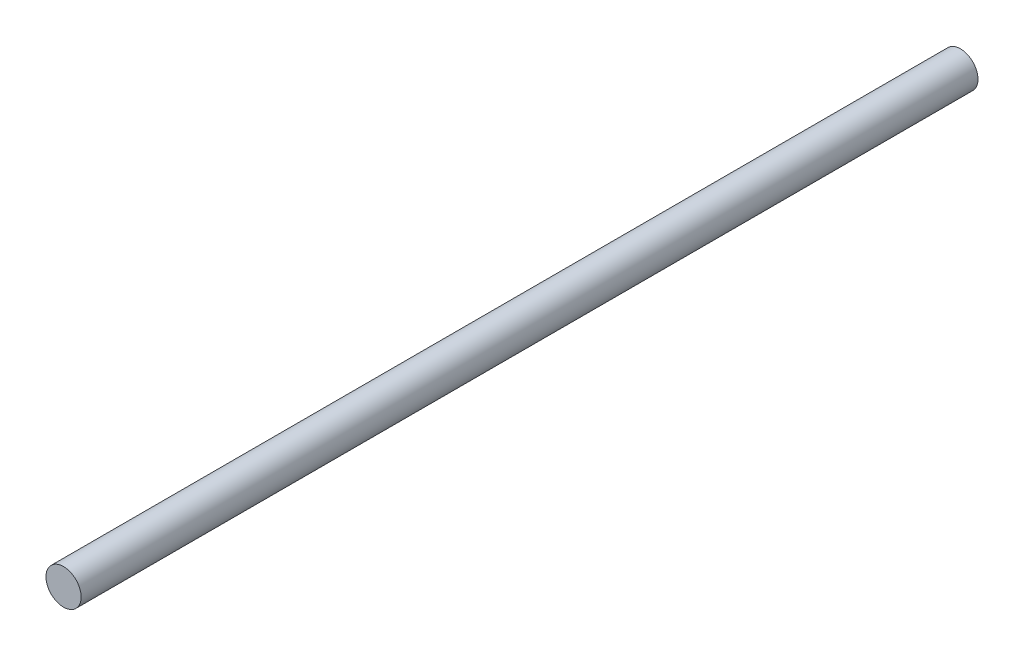
ISO-10303-21;
HEADER;
FILE_DESCRIPTION(('STEP AP214'),'2;1');
FILE_NAME('part.step','',(''),(''),'','','');
FILE_SCHEMA(('AUTOMOTIVE_DESIGN { 1 0 10303 214 1 1 1 1 }'));
ENDSEC;
DATA;
#1=APPLICATION_CONTEXT('core data for automotive mechanical design processes');
#2=APPLICATION_PROTOCOL_DEFINITION('international standard','automotive_design',2000,#1);
#3=PRODUCT_CONTEXT('',#1,'mechanical');
#4=PRODUCT('Part','Part','',(#3));
#5=PRODUCT_RELATED_PRODUCT_CATEGORY('part','',(#4));
#6=PRODUCT_DEFINITION_FORMATION('','',#4);
#7=PRODUCT_DEFINITION_CONTEXT('part definition',#1,'design');
#8=PRODUCT_DEFINITION('design','',#6,#7);
#9=PRODUCT_DEFINITION_SHAPE('','',#8);
#10=(LENGTH_UNIT() NAMED_UNIT(*) SI_UNIT(.MILLI.,.METRE.));
#11=(NAMED_UNIT(*) PLANE_ANGLE_UNIT() SI_UNIT($,.RADIAN.));
#12=(NAMED_UNIT(*) SI_UNIT($,.STERADIAN.) SOLID_ANGLE_UNIT());
#13=UNCERTAINTY_MEASURE_WITH_UNIT(LENGTH_MEASURE(1.E-05),#10,'distance_accuracy_value','');
#14=(GEOMETRIC_REPRESENTATION_CONTEXT(3) GLOBAL_UNCERTAINTY_ASSIGNED_CONTEXT((#13)) GLOBAL_UNIT_ASSIGNED_CONTEXT((#10,
#11,#12)) REPRESENTATION_CONTEXT('',''));
#15=CARTESIAN_POINT('',(0.,0.,0.));
#16=DIRECTION('',(0.,0.,1.));
#17=DIRECTION('',(1.,0.,0.));
#18=AXIS2_PLACEMENT_3D('',#15,#16,#17);
#19=CARTESIAN_POINT('',(0.,0.,255.));
#20=DIRECTION('',(0.,0.,-1.));
#21=DIRECTION('',(-1.,0.,0.));
#22=AXIS2_PLACEMENT_3D('',#19,#20,#21);
#23=CYLINDRICAL_SURFACE('',#22,5.);
#24=CARTESIAN_POINT('',(0.,0.,255.));
#25=DIRECTION('',(0.,0.,1.));
#26=DIRECTION('',(1.,0.,0.));
#27=AXIS2_PLACEMENT_3D('',#24,#25,#26);
#28=CIRCLE('',#27,5.);
#29=CARTESIAN_POINT('',(5.,0.,255.));
#30=VERTEX_POINT('',#29);
#31=EDGE_CURVE('E10',#30,#30,#28,.T.);
#32=ORIENTED_EDGE('',*,*,#31,.F.);
#33=EDGE_LOOP('',(#32));
#34=FACE_BOUND('',#33,.T.);
#35=CARTESIAN_POINT('',(0.,0.,0.));
#36=DIRECTION('',(0.,0.,1.));
#37=DIRECTION('',(1.,0.,0.));
#38=AXIS2_PLACEMENT_3D('',#35,#36,#37);
#39=CIRCLE('',#38,5.);
#40=CARTESIAN_POINT('',(5.,0.,0.));
#41=VERTEX_POINT('',#40);
#42=EDGE_CURVE('E40',#41,#41,#39,.T.);
#43=ORIENTED_EDGE('',*,*,#42,.T.);
#44=EDGE_LOOP('',(#43));
#45=FACE_BOUND('',#44,.T.);
#46=ADVANCED_FACE('F37',(#34,#45),#23,.T.);
#47=CARTESIAN_POINT('',(0.,0.,255.));
#48=DIRECTION('',(0.,0.,1.));
#49=DIRECTION('',(1.,0.,0.));
#50=AXIS2_PLACEMENT_3D('',#47,#48,#49);
#51=PLANE('',#50);
#52=ORIENTED_EDGE('',*,*,#31,.T.);
#53=EDGE_LOOP('',(#52));
#54=FACE_BOUND('',#53,.T.);
#55=ADVANCED_FACE('F52',(#54),#51,.T.);
#56=CARTESIAN_POINT('',(0.,0.,0.));
#57=DIRECTION('',(0.,0.,1.));
#58=DIRECTION('',(1.,0.,0.));
#59=AXIS2_PLACEMENT_3D('',#56,#57,#58);
#60=PLANE('',#59);
#61=ORIENTED_EDGE('',*,*,#42,.F.);
#62=EDGE_LOOP('',(#61));
#63=FACE_BOUND('',#62,.T.);
#64=ADVANCED_FACE('F50',(#63),#60,.F.);
#65=CLOSED_SHELL('',(#46,#55,#64));
#66=MANIFOLD_SOLID_BREP('B2',#65);
#67=ADVANCED_BREP_SHAPE_REPRESENTATION('',(#18,#66),#14);
#68=SHAPE_DEFINITION_REPRESENTATION(#9,#67);
ENDSEC;
END-ISO-10303-21;
